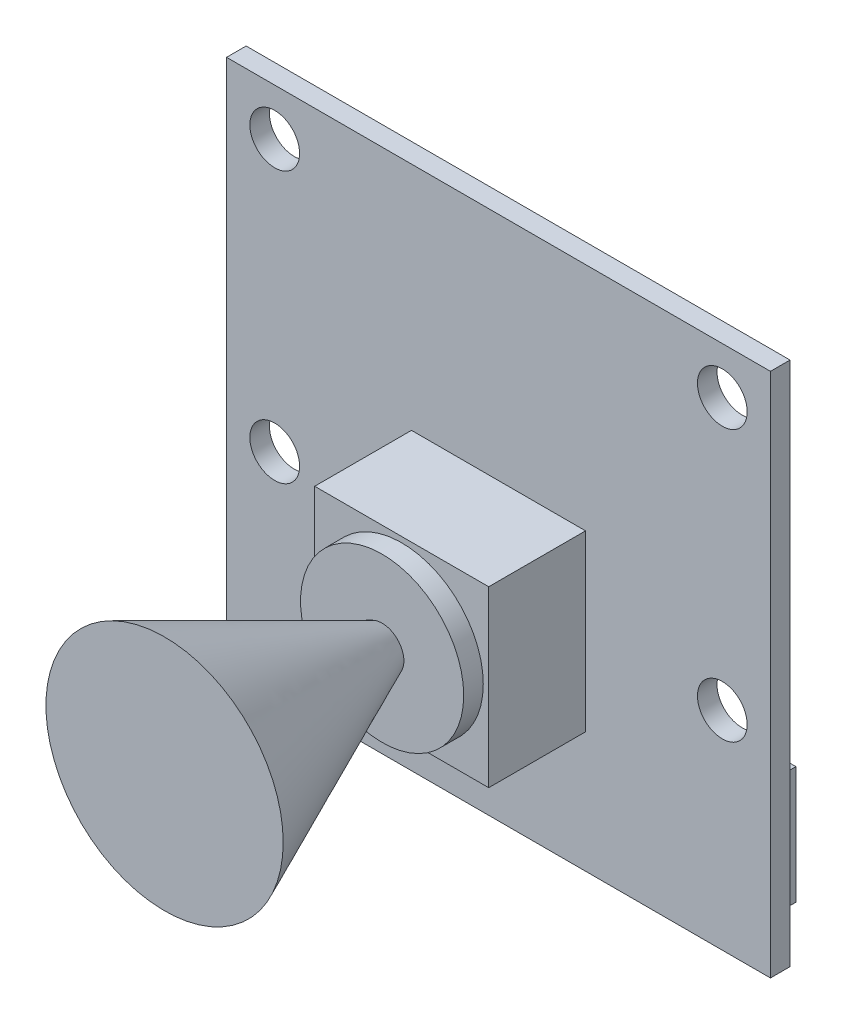
ISO-10303-21;
HEADER;
FILE_DESCRIPTION(('STEP AP214'),'2;1');
FILE_NAME('part.step','',(''),(''),'','','');
FILE_SCHEMA(('AUTOMOTIVE_DESIGN { 1 0 10303 214 1 1 1 1 }'));
ENDSEC;
DATA;
#1=APPLICATION_CONTEXT('core data for automotive mechanical design processes');
#2=APPLICATION_PROTOCOL_DEFINITION('international standard','automotive_design',2000,#1);
#3=PRODUCT_CONTEXT('',#1,'mechanical');
#4=PRODUCT('Part','Part','',(#3));
#5=PRODUCT_RELATED_PRODUCT_CATEGORY('part','',(#4));
#6=PRODUCT_DEFINITION_FORMATION('','',#4);
#7=PRODUCT_DEFINITION_CONTEXT('part definition',#1,'design');
#8=PRODUCT_DEFINITION('design','',#6,#7);
#9=PRODUCT_DEFINITION_SHAPE('','',#8);
#10=(LENGTH_UNIT() NAMED_UNIT(*) SI_UNIT(.MILLI.,.METRE.));
#11=(NAMED_UNIT(*) PLANE_ANGLE_UNIT() SI_UNIT($,.RADIAN.));
#12=(NAMED_UNIT(*) SI_UNIT($,.STERADIAN.) SOLID_ANGLE_UNIT());
#13=UNCERTAINTY_MEASURE_WITH_UNIT(LENGTH_MEASURE(1.E-05),#10,'distance_accuracy_value','');
#14=(GEOMETRIC_REPRESENTATION_CONTEXT(3) GLOBAL_UNCERTAINTY_ASSIGNED_CONTEXT((#13)) GLOBAL_UNIT_ASSIGNED_CONTEXT((#10,
#11,#12)) REPRESENTATION_CONTEXT('',''));
#15=CARTESIAN_POINT('',(0.,0.,0.));
#16=DIRECTION('',(0.,0.,1.));
#17=DIRECTION('',(1.,0.,0.));
#18=AXIS2_PLACEMENT_3D('',#15,#16,#17);
#19=CARTESIAN_POINT('',(0.,-2.52499999999999,6.25));
#20=DIRECTION('',(0.,0.,1.));
#21=DIRECTION('',(1.,0.,0.));
#22=AXIS2_PLACEMENT_3D('',#19,#20,#21);
#23=PLANE('',#22);
#24=CARTESIAN_POINT('',(0.,-2.52499999999999,6.25));
#25=DIRECTION('',(0.,0.,1.));
#26=DIRECTION('',(1.,0.,0.));
#27=AXIS2_PLACEMENT_3D('',#24,#25,#26);
#28=CIRCLE('',#27,3.75);
#29=CARTESIAN_POINT('',(3.74999999999999,-2.52499999999999,6.25));
#30=VERTEX_POINT('',#29);
#31=EDGE_CURVE('E365',#30,#30,#28,.T.);
#32=ORIENTED_EDGE('',*,*,#31,.T.);
#33=EDGE_LOOP('',(#32));
#34=FACE_BOUND('',#33,.T.);
#35=CARTESIAN_POINT('',(-1.00000000000001,-2.52499999999999,6.25));
#36=CARTESIAN_POINT('',(-0.999996306994965,-2.46893499550475,6.25));
#37=CARTESIAN_POINT('',(-0.995350622196305,-2.41282762119064,6.25));
#38=CARTESIAN_POINT('',(-0.976661927148961,-2.30216098638151,6.25));
#39=CARTESIAN_POINT('',(-0.962610716278052,-2.24760312020311,6.25));
#40=CARTESIAN_POINT('',(-0.925508351376268,-2.14170667745026,6.25));
#41=CARTESIAN_POINT('',(-0.902467465794685,-2.09036450512899,6.25));
#42=CARTESIAN_POINT('',(-0.848058068879219,-1.99218539502379,6.25));
#43=CARTESIAN_POINT('',(-0.816674564418837,-1.94535677741744,6.25));
#44=CARTESIAN_POINT('',(-0.74653534628725,-1.85757712425992,6.25));
#45=CARTESIAN_POINT('',(-0.707777979460206,-1.81662741032686,6.25));
#46=CARTESIAN_POINT('',(-0.624058099402262,-1.74181622803023,6.25));
#47=CARTESIAN_POINT('',(-0.579106389450858,-1.70794267174781,6.25));
#48=CARTESIAN_POINT('',(-0.483750278218312,-1.6479248133205,6.25));
#49=CARTESIAN_POINT('',(-0.433301535903738,-1.62185086332074,6.25));
#50=CARTESIAN_POINT('',(-0.328702129475173,-1.57866080582758,6.25));
#51=CARTESIAN_POINT('',(-0.274551664243998,-1.56154421750817,6.25));
#52=CARTESIAN_POINT('',(-0.164781358807762,-1.53694853461237,6.25));
#53=CARTESIAN_POINT('',(-0.109186171138399,-1.52935886184247,6.25));
#54=CARTESIAN_POINT('',(0.00249802410029693,-1.52344386541205,6.25));
#55=CARTESIAN_POINT('',(0.0585871084118823,-1.52512000778215,6.25));
#56=CARTESIAN_POINT('',(0.170318702083456,-1.53786206881477,6.25));
#57=CARTESIAN_POINT('',(0.225949739378718,-1.54902980285331,6.25));
#58=CARTESIAN_POINT('',(0.334479304909576,-1.58068768357958,6.25));
#59=CARTESIAN_POINT('',(0.38737850996566,-1.60117550872553,6.25));
#60=CARTESIAN_POINT('',(0.488308954947386,-1.65050382307394,6.25));
#61=CARTESIAN_POINT('',(0.536392220048153,-1.67923809637645,6.25));
#62=CARTESIAN_POINT('',(0.627201871156826,-1.74434332804429,6.25));
#63=CARTESIAN_POINT('',(0.669918618627324,-1.78072772180188,6.25));
#64=CARTESIAN_POINT('',(0.749114694049686,-1.86045127580089,6.25));
#65=CARTESIAN_POINT('',(0.785530298805205,-1.90385376633376,6.25));
#66=CARTESIAN_POINT('',(0.850502101497384,-1.99607766888967,6.25));
#67=CARTESIAN_POINT('',(0.879071983385435,-2.04488943496862,6.25));
#68=CARTESIAN_POINT('',(0.927580043556275,-2.1466955786334,6.25));
#69=CARTESIAN_POINT('',(0.947509466939668,-2.19969413449917,6.25));
#70=CARTESIAN_POINT('',(0.978057662728628,-2.30832114704335,6.25));
#71=CARTESIAN_POINT('',(0.988674287085743,-2.36395020734535,6.25));
#72=CARTESIAN_POINT('',(1.00036731884419,-2.47563359029439,6.25));
#73=CARTESIAN_POINT('',(1.00153705369049,-2.53167826375401,6.25));
#74=CARTESIAN_POINT('',(0.994620413523798,-2.64319033453264,6.25));
#75=CARTESIAN_POINT('',(0.986535643532167,-2.69865783026903,6.25));
#76=CARTESIAN_POINT('',(0.96097929269167,-2.80809122999947,6.25));
#77=CARTESIAN_POINT('',(0.943397402900872,-2.86203148674256,6.25));
#78=CARTESIAN_POINT('',(0.899331060245317,-2.96614121152984,6.25));
#79=CARTESIAN_POINT('',(0.872846045806734,-3.0163104414683,6.25));
#80=CARTESIAN_POINT('',(0.812134009896514,-3.11095847371733,6.25));
#81=CARTESIAN_POINT('',(0.777992685738152,-3.15549232277643,6.25));
#82=CARTESIAN_POINT('',(0.70280326938518,-3.2382880897712,6.25));
#83=CARTESIAN_POINT('',(0.661754966280285,-3.27654981611198,6.25));
#84=CARTESIAN_POINT('',(0.573354892961709,-3.34613980725396,6.25));
#85=CARTESIAN_POINT('',(0.5259345552187,-3.37738107330094,6.25));
#86=CARTESIAN_POINT('',(0.426500332278462,-3.43138297577567,6.25));
#87=CARTESIAN_POINT('',(0.374487693527669,-3.45414590470118,6.25));
#88=CARTESIAN_POINT('',(0.267747377340753,-3.49033683046368,6.25));
#89=CARTESIAN_POINT('',(0.213043186642256,-3.50383406845142,6.25));
#90=CARTESIAN_POINT('',(0.102135047389826,-3.52142623246307,6.25));
#91=CARTESIAN_POINT('',(0.0459305897118959,-3.5255179245493,6.25));
#92=CARTESIAN_POINT('',(-0.0664434628607701,-3.52437883063078,6.25));
#93=CARTESIAN_POINT('',(-0.122612960919627,-3.51913835787382,6.25));
#94=CARTESIAN_POINT('',(-0.23324797888165,-3.49923781438483,6.25));
#95=CARTESIAN_POINT('',(-0.287714108369473,-3.48458115483023,6.25));
#96=CARTESIAN_POINT('',(-0.393314242660882,-3.44628840411159,6.25));
#97=CARTESIAN_POINT('',(-0.444452139636769,-3.42266303069248,6.25));
#98=CARTESIAN_POINT('',(-0.542049700017669,-3.36716609083734,6.25));
#99=CARTESIAN_POINT('',(-0.588508225875332,-3.3352925259689,6.25));
#100=CARTESIAN_POINT('',(-0.675484093255291,-3.2642418146366,6.25));
#101=CARTESIAN_POINT('',(-0.715999082307131,-3.2250617901135,6.25));
#102=CARTESIAN_POINT('',(-0.789941009538081,-3.14050354115835,6.25));
#103=CARTESIAN_POINT('',(-0.823368256352866,-3.09512558675664,6.25));
#104=CARTESIAN_POINT('',(-0.882385176044294,-2.99903106093783,6.25));
#105=CARTESIAN_POINT('',(-0.907910462738526,-2.94827493494494,6.25));
#106=CARTESIAN_POINT('',(-0.949919874340684,-2.84320184102994,6.25));
#107=CARTESIAN_POINT('',(-0.966415862319407,-2.78888965082777,6.25));
#108=CARTESIAN_POINT('',(-0.985454454021836,-2.6993484569695,6.25));
#109=CARTESIAN_POINT('',(-0.990917483215469,-2.66471303557232,6.25));
#110=CARTESIAN_POINT('',(-0.998191720994227,-2.59505730152406,6.25));
#111=CARTESIAN_POINT('',(-1.00000230788421,-2.56003692436812,6.25));
#112=CARTESIAN_POINT('',(-1.00000000000001,-2.52499999999999,6.25));
#113=B_SPLINE_CURVE_WITH_KNOTS('',3,(#35,#36,#37,#38,#39,#40,#41,#42,#43,#44,#45,#46,#47,#48,
#49,#50,#51,#52,#53,#54,#55,#56,#57,#58,#59,#60,#61,#62,#63,#64,#65,#66,#67,#68,#69,#70,#71,#72,
#73,#74,#75,#76,#77,#78,#79,#80,#81,#82,#83,#84,#85,#86,#87,#88,#89,#90,#91,#92,#93,#94,#95,#96,
#97,#98,#99,#100,#101,#102,#103,#104,#105,#106,#107,#108,#109,#110,#111,#112),.UNSPECIFIED.,.T.,
.F.,(4,2,2,2,2,2,2,2,2,2,2,2,2,2,2,2,2,2,2,2,2,2,2,2,2,2,2,2,2,2,2,2,2,2,2,2,2,2,4),(0.,
0.16806481134177,0.336276348592942,0.504296306217517,0.672620290457807,0.840982056034648,
1.00905382055622,1.17859879243335,1.34813466230021,1.51568397790197,1.68325980379473,
1.85265622139595,2.02201046712321,2.18927441823616,2.3568346148147,2.52600118570525,
2.69487080683166,2.86391113658914,3.03299044618626,3.20039732340819,3.36777517142616,
3.53714027900402,3.70651607146694,3.87408309899501,4.04165524424901,4.2112016686703,
4.38070221529105,4.54892190246147,4.71719942047655,4.88565171175275,5.05404301264137,
5.22223371369207,5.39046520343676,5.55876310111044,5.72705366874785,5.8966814382409,
6.06608580542762,6.17109733791551,6.27612674328061),.UNSPECIFIED.);
#114=CARTESIAN_POINT('',(0.999999999999994,-2.52499999999999,6.25));
#115=VERTEX_POINT('',#114);
#116=EDGE_CURVE('E170',#115,#115,#113,.F.);
#117=ORIENTED_EDGE('',*,*,#116,.F.);
#118=EDGE_LOOP('',(#117));
#119=FACE_BOUND('',#118,.T.);
#120=ADVANCED_FACE('F55',(#34,#119),#23,.T.);
#121=CARTESIAN_POINT('',(0.,0.,5.35));
#122=DIRECTION('',(0.,0.,1.));
#123=DIRECTION('',(1.,0.,0.));
#124=AXIS2_PLACEMENT_3D('',#121,#122,#123);
#125=PLANE('',#124);
#126=DIRECTION('',(0.,-1.,0.));
#127=VECTOR('',#126,1.);
#128=CARTESIAN_POINT('',(-4.00000000000001,1.47500000000001,5.35));
#129=LINE('',#128,#127);
#130=CARTESIAN_POINT('',(-4.00000000000001,1.47500000000001,5.35));
#131=VERTEX_POINT('',#130);
#132=CARTESIAN_POINT('',(-4.00000000000001,-6.52499999999999,5.35));
#133=VERTEX_POINT('',#132);
#134=EDGE_CURVE('E374',#131,#133,#129,.T.);
#135=ORIENTED_EDGE('',*,*,#134,.T.);
#136=DIRECTION('',(1.,0.,0.));
#137=VECTOR('',#136,1.);
#138=CARTESIAN_POINT('',(-4.00000000000001,-6.52499999999999,5.35));
#139=LINE('',#138,#137);
#140=CARTESIAN_POINT('',(3.99999999999999,-6.52499999999999,5.35));
#141=VERTEX_POINT('',#140);
#142=EDGE_CURVE('E402',#133,#141,#139,.T.);
#143=ORIENTED_EDGE('',*,*,#142,.T.);
#144=DIRECTION('',(0.,1.,0.));
#145=VECTOR('',#144,1.);
#146=CARTESIAN_POINT('',(3.99999999999999,1.47500000000001,5.35));
#147=LINE('',#146,#145);
#148=CARTESIAN_POINT('',(3.99999999999999,1.47500000000001,5.35));
#149=VERTEX_POINT('',#148);
#150=EDGE_CURVE('E381',#141,#149,#147,.T.);
#151=ORIENTED_EDGE('',*,*,#150,.T.);
#152=DIRECTION('',(-1.,0.,0.));
#153=VECTOR('',#152,1.);
#154=CARTESIAN_POINT('',(-4.00000000000001,1.47500000000001,5.35));
#155=LINE('',#154,#153);
#156=EDGE_CURVE('E378',#149,#131,#155,.T.);
#157=ORIENTED_EDGE('',*,*,#156,.T.);
#158=EDGE_LOOP('',(#135,#143,#151,#157));
#159=FACE_BOUND('',#158,.T.);
#160=CARTESIAN_POINT('',(0.,-2.52499999999999,5.35));
#161=DIRECTION('',(0.,0.,1.));
#162=DIRECTION('',(1.,0.,0.));
#163=AXIS2_PLACEMENT_3D('',#160,#161,#162);
#164=CIRCLE('',#163,3.75);
#165=CARTESIAN_POINT('',(3.74999999999999,-2.52499999999999,5.35));
#166=VERTEX_POINT('',#165);
#167=EDGE_CURVE('E229',#166,#166,#164,.T.);
#168=ORIENTED_EDGE('',*,*,#167,.F.);
#169=EDGE_LOOP('',(#168));
#170=FACE_BOUND('',#169,.T.);
#171=ADVANCED_FACE('F237',(#159,#170),#125,.T.);
#172=CARTESIAN_POINT('',(0.,0.,0.9));
#173=DIRECTION('',(0.,0.,-1.));
#174=DIRECTION('',(-1.,0.,0.));
#175=AXIS2_PLACEMENT_3D('',#172,#173,#174);
#176=PLANE('',#175);
#177=CARTESIAN_POINT('',(-10.2869999999995,-2.52099999999997,0.9));
#178=DIRECTION('',(0.,0.,1.));
#179=DIRECTION('',(1.,0.,0.));
#180=AXIS2_PLACEMENT_3D('',#177,#178,#179);
#181=CIRCLE('',#180,1.143);
#182=CARTESIAN_POINT('',(-9.14399999999952,-2.52099999999997,0.9));
#183=VERTEX_POINT('',#182);
#184=EDGE_CURVE('E327',#183,#183,#181,.T.);
#185=ORIENTED_EDGE('',*,*,#184,.F.);
#186=EDGE_LOOP('',(#185));
#187=FACE_BOUND('',#186,.T.);
#188=CARTESIAN_POINT('',(10.2870000000005,-2.52099999999998,0.9));
#189=DIRECTION('',(0.,0.,1.));
#190=DIRECTION('',(1.,0.,0.));
#191=AXIS2_PLACEMENT_3D('',#188,#189,#190);
#192=CIRCLE('',#191,1.143);
#193=CARTESIAN_POINT('',(11.4300000000005,-2.52099999999998,0.9));
#194=VERTEX_POINT('',#193);
#195=EDGE_CURVE('E324',#194,#194,#192,.T.);
#196=ORIENTED_EDGE('',*,*,#195,.F.);
#197=EDGE_LOOP('',(#196));
#198=FACE_BOUND('',#197,.T.);
#199=CARTESIAN_POINT('',(10.287,9.92500000000002,0.9));
#200=DIRECTION('',(0.,0.,1.));
#201=DIRECTION('',(1.,0.,0.));
#202=AXIS2_PLACEMENT_3D('',#199,#200,#201);
#203=CIRCLE('',#202,1.143);
#204=CARTESIAN_POINT('',(11.43,9.92500000000002,0.9));
#205=VERTEX_POINT('',#204);
#206=EDGE_CURVE('E320',#205,#205,#203,.T.);
#207=ORIENTED_EDGE('',*,*,#206,.F.);
#208=EDGE_LOOP('',(#207));
#209=FACE_BOUND('',#208,.T.);
#210=CARTESIAN_POINT('',(-10.287,9.92500000000002,0.9));
#211=DIRECTION('',(0.,0.,1.));
#212=DIRECTION('',(1.,0.,0.));
#213=AXIS2_PLACEMENT_3D('',#210,#211,#212);
#214=CIRCLE('',#213,1.143);
#215=CARTESIAN_POINT('',(-9.144,9.92500000000002,0.9));
#216=VERTEX_POINT('',#215);
#217=EDGE_CURVE('E316',#216,#216,#214,.T.);
#218=ORIENTED_EDGE('',*,*,#217,.F.);
#219=EDGE_LOOP('',(#218));
#220=FACE_BOUND('',#219,.T.);
#221=DIRECTION('',(0.,-1.,0.));
#222=VECTOR('',#221,1.);
#223=CARTESIAN_POINT('',(-12.5,12.075,0.9));
#224=LINE('',#223,#222);
#225=CARTESIAN_POINT('',(-12.5,12.075,0.9));
#226=VERTEX_POINT('',#225);
#227=CARTESIAN_POINT('',(-12.5,-12.075,0.9));
#228=VERTEX_POINT('',#227);
#229=EDGE_CURVE('E355',#226,#228,#224,.T.);
#230=ORIENTED_EDGE('',*,*,#229,.T.);
#231=DIRECTION('',(1.,0.,0.));
#232=VECTOR('',#231,1.);
#233=CARTESIAN_POINT('',(12.5,-12.075,0.9));
#234=LINE('',#233,#232);
#235=CARTESIAN_POINT('',(12.5,-12.075,0.9));
#236=VERTEX_POINT('',#235);
#237=EDGE_CURVE('E388',#228,#236,#234,.T.);
#238=ORIENTED_EDGE('',*,*,#237,.T.);
#239=DIRECTION('',(0.,1.,0.));
#240=VECTOR('',#239,1.);
#241=CARTESIAN_POINT('',(12.5,12.075,0.9));
#242=LINE('',#241,#240);
#243=CARTESIAN_POINT('',(12.5,12.075,0.9));
#244=VERTEX_POINT('',#243);
#245=EDGE_CURVE('E390',#236,#244,#242,.T.);
#246=ORIENTED_EDGE('',*,*,#245,.T.);
#247=DIRECTION('',(-1.,0.,0.));
#248=VECTOR('',#247,1.);
#249=CARTESIAN_POINT('',(12.5,12.075,0.9));
#250=LINE('',#249,#248);
#251=EDGE_CURVE('E299',#244,#226,#250,.T.);
#252=ORIENTED_EDGE('',*,*,#251,.T.);
#253=EDGE_LOOP('',(#230,#238,#246,#252));
#254=FACE_BOUND('',#253,.T.);
#255=DIRECTION('',(0.,-1.,0.));
#256=VECTOR('',#255,1.);
#257=CARTESIAN_POINT('',(-4.00000000000001,1.47500000000001,0.9));
#258=LINE('',#257,#256);
#259=CARTESIAN_POINT('',(-4.00000000000001,1.47500000000001,0.9));
#260=VERTEX_POINT('',#259);
#261=CARTESIAN_POINT('',(-4.00000000000001,-6.52499999999999,0.9));
#262=VERTEX_POINT('',#261);
#263=EDGE_CURVE('E357',#260,#262,#258,.T.);
#264=ORIENTED_EDGE('',*,*,#263,.F.);
#265=DIRECTION('',(-1.,0.,0.));
#266=VECTOR('',#265,1.);
#267=CARTESIAN_POINT('',(-4.00000000000001,1.47500000000001,0.9));
#268=LINE('',#267,#266);
#269=CARTESIAN_POINT('',(3.99999999999999,1.47500000000001,0.9));
#270=VERTEX_POINT('',#269);
#271=EDGE_CURVE('E359',#270,#260,#268,.T.);
#272=ORIENTED_EDGE('',*,*,#271,.F.);
#273=DIRECTION('',(0.,1.,0.));
#274=VECTOR('',#273,1.);
#275=CARTESIAN_POINT('',(3.99999999999999,1.47500000000001,0.9));
#276=LINE('',#275,#274);
#277=CARTESIAN_POINT('',(3.99999999999999,-6.52499999999999,0.9));
#278=VERTEX_POINT('',#277);
#279=EDGE_CURVE('E375',#278,#270,#276,.T.);
#280=ORIENTED_EDGE('',*,*,#279,.F.);
#281=DIRECTION('',(1.,0.,0.));
#282=VECTOR('',#281,1.);
#283=CARTESIAN_POINT('',(-4.00000000000001,-6.52499999999999,0.9));
#284=LINE('',#283,#282);
#285=EDGE_CURVE('E362',#262,#278,#284,.T.);
#286=ORIENTED_EDGE('',*,*,#285,.F.);
#287=EDGE_LOOP('',(#264,#272,#280,#286));
#288=FACE_BOUND('',#287,.T.);
#289=ADVANCED_FACE('F246',(#187,#198,#209,#220,#254,#288),#176,.F.);
#290=CARTESIAN_POINT('',(-12.5,12.075,0.9));
#291=DIRECTION('',(1.,0.,0.));
#292=DIRECTION('',(0.,1.,0.));
#293=AXIS2_PLACEMENT_3D('',#290,#291,#292);
#294=PLANE('',#293);
#295=DIRECTION('',(0.,-1.,0.));
#296=VECTOR('',#295,1.);
#297=CARTESIAN_POINT('',(-12.5,12.075,0.));
#298=LINE('',#297,#296);
#299=CARTESIAN_POINT('',(-12.5,12.075,0.));
#300=VERTEX_POINT('',#299);
#301=CARTESIAN_POINT('',(-12.5,-12.075,0.));
#302=VERTEX_POINT('',#301);
#303=EDGE_CURVE('E288',#300,#302,#298,.T.);
#304=ORIENTED_EDGE('',*,*,#303,.T.);
#305=DIRECTION('',(0.,0.,-1.));
#306=VECTOR('',#305,1.);
#307=CARTESIAN_POINT('',(-12.5,-12.075,0.9));
#308=LINE('',#307,#306);
#309=EDGE_CURVE('E13',#228,#302,#308,.T.);
#310=ORIENTED_EDGE('',*,*,#309,.F.);
#311=ORIENTED_EDGE('',*,*,#229,.F.);
#312=DIRECTION('',(0.,0.,-1.));
#313=VECTOR('',#312,1.);
#314=CARTESIAN_POINT('',(-12.5,12.075,0.9));
#315=LINE('',#314,#313);
#316=EDGE_CURVE('E291',#226,#300,#315,.T.);
#317=ORIENTED_EDGE('',*,*,#316,.T.);
#318=EDGE_LOOP('',(#304,#310,#311,#317));
#319=FACE_BOUND('',#318,.T.);
#320=ADVANCED_FACE('F57',(#319),#294,.F.);
#321=CARTESIAN_POINT('',(12.5,-12.075,0.9));
#322=DIRECTION('',(0.,1.,0.));
#323=DIRECTION('',(-1.,0.,0.));
#324=AXIS2_PLACEMENT_3D('',#321,#322,#323);
#325=PLANE('',#324);
#326=DIRECTION('',(1.,0.,0.));
#327=VECTOR('',#326,1.);
#328=CARTESIAN_POINT('',(12.5,-12.075,0.));
#329=LINE('',#328,#327);
#330=CARTESIAN_POINT('',(-10.08,-12.075,0.));
#331=VERTEX_POINT('',#330);
#332=EDGE_CURVE('E231',#302,#331,#329,.T.);
#333=ORIENTED_EDGE('',*,*,#332,.T.);
#334=DIRECTION('',(0.,0.,1.));
#335=VECTOR('',#334,1.);
#336=CARTESIAN_POINT('',(-10.08,-12.075,-2.7));
#337=LINE('',#336,#335);
#338=CARTESIAN_POINT('',(-10.08,-12.075,-2.7));
#339=VERTEX_POINT('',#338);
#340=EDGE_CURVE('E151',#339,#331,#337,.T.);
#341=ORIENTED_EDGE('',*,*,#340,.F.);
#342=DIRECTION('',(-1.,0.,0.));
#343=VECTOR('',#342,1.);
#344=CARTESIAN_POINT('',(10.07,-12.075,-2.7));
#345=LINE('',#344,#343);
#346=CARTESIAN_POINT('',(10.07,-12.075,-2.7));
#347=VERTEX_POINT('',#346);
#348=EDGE_CURVE('E144',#347,#339,#345,.T.);
#349=ORIENTED_EDGE('',*,*,#348,.F.);
#350=DIRECTION('',(0.,0.,1.));
#351=VECTOR('',#350,1.);
#352=CARTESIAN_POINT('',(10.07,-12.075,-2.7));
#353=LINE('',#352,#351);
#354=CARTESIAN_POINT('',(10.07,-12.075,0.));
#355=VERTEX_POINT('',#354);
#356=EDGE_CURVE('E149',#347,#355,#353,.T.);
#357=ORIENTED_EDGE('',*,*,#356,.T.);
#358=CARTESIAN_POINT('',(12.5,-12.075,0.));
#359=VERTEX_POINT('',#358);
#360=EDGE_CURVE('E77',#355,#359,#329,.T.);
#361=ORIENTED_EDGE('',*,*,#360,.T.);
#362=DIRECTION('',(0.,0.,-1.));
#363=VECTOR('',#362,1.);
#364=CARTESIAN_POINT('',(12.5,-12.075,0.9));
#365=LINE('',#364,#363);
#366=EDGE_CURVE('E64',#236,#359,#365,.T.);
#367=ORIENTED_EDGE('',*,*,#366,.F.);
#368=ORIENTED_EDGE('',*,*,#237,.F.);
#369=ORIENTED_EDGE('',*,*,#309,.T.);
#370=EDGE_LOOP('',(#333,#341,#349,#357,#361,#367,#368,#369));
#371=FACE_BOUND('',#370,.T.);
#372=ADVANCED_FACE('F147',(#371),#325,.F.);
#373=CARTESIAN_POINT('',(12.5,12.075,0.9));
#374=DIRECTION('',(-1.,0.,0.));
#375=DIRECTION('',(0.,-1.,0.));
#376=AXIS2_PLACEMENT_3D('',#373,#374,#375);
#377=PLANE('',#376);
#378=DIRECTION('',(0.,1.,0.));
#379=VECTOR('',#378,1.);
#380=CARTESIAN_POINT('',(12.5,12.075,0.));
#381=LINE('',#380,#379);
#382=CARTESIAN_POINT('',(12.5,12.075,0.));
#383=VERTEX_POINT('',#382);
#384=EDGE_CURVE('E303',#359,#383,#381,.T.);
#385=ORIENTED_EDGE('',*,*,#384,.T.);
#386=DIRECTION('',(0.,0.,-1.));
#387=VECTOR('',#386,1.);
#388=CARTESIAN_POINT('',(12.5,12.075,0.9));
#389=LINE('',#388,#387);
#390=EDGE_CURVE('E394',#244,#383,#389,.T.);
#391=ORIENTED_EDGE('',*,*,#390,.F.);
#392=ORIENTED_EDGE('',*,*,#245,.F.);
#393=ORIENTED_EDGE('',*,*,#366,.T.);
#394=EDGE_LOOP('',(#385,#391,#392,#393));
#395=FACE_BOUND('',#394,.T.);
#396=ADVANCED_FACE('F273',(#395),#377,.F.);
#397=CARTESIAN_POINT('',(12.5,12.075,0.9));
#398=DIRECTION('',(0.,-1.,0.));
#399=DIRECTION('',(1.,0.,0.));
#400=AXIS2_PLACEMENT_3D('',#397,#398,#399);
#401=PLANE('',#400);
#402=DIRECTION('',(-1.,0.,0.));
#403=VECTOR('',#402,1.);
#404=CARTESIAN_POINT('',(12.5,12.075,0.));
#405=LINE('',#404,#403);
#406=EDGE_CURVE('E389',#383,#300,#405,.T.);
#407=ORIENTED_EDGE('',*,*,#406,.T.);
#408=ORIENTED_EDGE('',*,*,#316,.F.);
#409=ORIENTED_EDGE('',*,*,#251,.F.);
#410=ORIENTED_EDGE('',*,*,#390,.T.);
#411=EDGE_LOOP('',(#407,#408,#409,#410));
#412=FACE_BOUND('',#411,.T.);
#413=ADVANCED_FACE('F269',(#412),#401,.F.);
#414=CARTESIAN_POINT('',(0.,0.,0.));
#415=DIRECTION('',(0.,0.,-1.));
#416=DIRECTION('',(-1.,0.,0.));
#417=AXIS2_PLACEMENT_3D('',#414,#415,#416);
#418=PLANE('',#417);
#419=CARTESIAN_POINT('',(-10.2869999999995,-2.52099999999997,0.));
#420=DIRECTION('',(0.,0.,-1.));
#421=DIRECTION('',(-1.,0.,0.));
#422=AXIS2_PLACEMENT_3D('',#419,#420,#421);
#423=CIRCLE('',#422,1.143);
#424=CARTESIAN_POINT('',(-11.4299999999995,-2.52099999999997,0.));
#425=VERTEX_POINT('',#424);
#426=EDGE_CURVE('E59',#425,#425,#423,.T.);
#427=ORIENTED_EDGE('',*,*,#426,.F.);
#428=EDGE_LOOP('',(#427));
#429=FACE_BOUND('',#428,.T.);
#430=CARTESIAN_POINT('',(10.2870000000005,-2.52099999999998,0.));
#431=DIRECTION('',(0.,0.,-1.));
#432=DIRECTION('',(-1.,0.,0.));
#433=AXIS2_PLACEMENT_3D('',#430,#431,#432);
#434=CIRCLE('',#433,1.143);
#435=CARTESIAN_POINT('',(9.14400000000049,-2.52099999999998,0.));
#436=VERTEX_POINT('',#435);
#437=EDGE_CURVE('E323',#436,#436,#434,.T.);
#438=ORIENTED_EDGE('',*,*,#437,.F.);
#439=EDGE_LOOP('',(#438));
#440=FACE_BOUND('',#439,.T.);
#441=CARTESIAN_POINT('',(10.287,9.92500000000002,0.));
#442=DIRECTION('',(0.,0.,-1.));
#443=DIRECTION('',(-1.,0.,0.));
#444=AXIS2_PLACEMENT_3D('',#441,#442,#443);
#445=CIRCLE('',#444,1.143);
#446=CARTESIAN_POINT('',(9.144,9.92500000000002,0.));
#447=VERTEX_POINT('',#446);
#448=EDGE_CURVE('E319',#447,#447,#445,.T.);
#449=ORIENTED_EDGE('',*,*,#448,.F.);
#450=EDGE_LOOP('',(#449));
#451=FACE_BOUND('',#450,.T.);
#452=CARTESIAN_POINT('',(-10.287,9.92500000000002,0.));
#453=DIRECTION('',(0.,0.,-1.));
#454=DIRECTION('',(-1.,0.,0.));
#455=AXIS2_PLACEMENT_3D('',#452,#453,#454);
#456=CIRCLE('',#455,1.143);
#457=CARTESIAN_POINT('',(-11.43,9.92500000000002,0.));
#458=VERTEX_POINT('',#457);
#459=EDGE_CURVE('E182',#458,#458,#456,.T.);
#460=ORIENTED_EDGE('',*,*,#459,.F.);
#461=EDGE_LOOP('',(#460));
#462=FACE_BOUND('',#461,.T.);
#463=DIRECTION('',(0.,-1.,0.));
#464=VECTOR('',#463,1.);
#465=CARTESIAN_POINT('',(10.07,-6.67499999999999,0.));
#466=LINE('',#465,#464);
#467=CARTESIAN_POINT('',(10.07,-6.67499999999999,0.));
#468=VERTEX_POINT('',#467);
#469=EDGE_CURVE('E72',#468,#355,#466,.T.);
#470=ORIENTED_EDGE('',*,*,#469,.F.);
#471=DIRECTION('',(1.,0.,0.));
#472=VECTOR('',#471,1.);
#473=CARTESIAN_POINT('',(10.07,-6.67499999999999,0.));
#474=LINE('',#473,#472);
#475=CARTESIAN_POINT('',(-10.08,-6.67499999999999,0.));
#476=VERTEX_POINT('',#475);
#477=EDGE_CURVE('E164',#476,#468,#474,.T.);
#478=ORIENTED_EDGE('',*,*,#477,.F.);
#479=DIRECTION('',(0.,1.,0.));
#480=VECTOR('',#479,1.);
#481=CARTESIAN_POINT('',(-10.08,-6.67499999999999,0.));
#482=LINE('',#481,#480);
#483=EDGE_CURVE('E181',#331,#476,#482,.T.);
#484=ORIENTED_EDGE('',*,*,#483,.F.);
#485=ORIENTED_EDGE('',*,*,#332,.F.);
#486=ORIENTED_EDGE('',*,*,#303,.F.);
#487=ORIENTED_EDGE('',*,*,#406,.F.);
#488=ORIENTED_EDGE('',*,*,#384,.F.);
#489=ORIENTED_EDGE('',*,*,#360,.F.);
#490=EDGE_LOOP('',(#470,#478,#484,#485,#486,#487,#488,#489));
#491=FACE_BOUND('',#490,.T.);
#492=ADVANCED_FACE('F262',(#429,#440,#451,#462,#491),#418,.T.);
#493=CARTESIAN_POINT('',(-4.00000000000001,1.47500000000001,5.35));
#494=DIRECTION('',(1.,0.,0.));
#495=DIRECTION('',(0.,1.,0.));
#496=AXIS2_PLACEMENT_3D('',#493,#494,#495);
#497=PLANE('',#496);
#498=ORIENTED_EDGE('',*,*,#263,.T.);
#499=DIRECTION('',(0.,0.,-1.));
#500=VECTOR('',#499,1.);
#501=CARTESIAN_POINT('',(-4.00000000000001,-6.52499999999999,5.35));
#502=LINE('',#501,#500);
#503=EDGE_CURVE('E293',#133,#262,#502,.T.);
#504=ORIENTED_EDGE('',*,*,#503,.F.);
#505=ORIENTED_EDGE('',*,*,#134,.F.);
#506=DIRECTION('',(0.,0.,-1.));
#507=VECTOR('',#506,1.);
#508=CARTESIAN_POINT('',(-4.00000000000001,1.47500000000001,5.35));
#509=LINE('',#508,#507);
#510=EDGE_CURVE('E370',#131,#260,#509,.T.);
#511=ORIENTED_EDGE('',*,*,#510,.T.);
#512=EDGE_LOOP('',(#498,#504,#505,#511));
#513=FACE_BOUND('',#512,.T.);
#514=ADVANCED_FACE('F258',(#513),#497,.F.);
#515=CARTESIAN_POINT('',(-4.00000000000001,-6.52499999999999,5.35));
#516=DIRECTION('',(0.,1.,0.));
#517=DIRECTION('',(-1.,0.,0.));
#518=AXIS2_PLACEMENT_3D('',#515,#516,#517);
#519=PLANE('',#518);
#520=ORIENTED_EDGE('',*,*,#285,.T.);
#521=DIRECTION('',(0.,0.,-1.));
#522=VECTOR('',#521,1.);
#523=CARTESIAN_POINT('',(3.99999999999999,-6.52499999999999,5.35));
#524=LINE('',#523,#522);
#525=EDGE_CURVE('E296',#141,#278,#524,.T.);
#526=ORIENTED_EDGE('',*,*,#525,.F.);
#527=ORIENTED_EDGE('',*,*,#142,.F.);
#528=ORIENTED_EDGE('',*,*,#503,.T.);
#529=EDGE_LOOP('',(#520,#526,#527,#528));
#530=FACE_BOUND('',#529,.T.);
#531=ADVANCED_FACE('F254',(#530),#519,.F.);
#532=CARTESIAN_POINT('',(3.99999999999999,1.47500000000001,5.35));
#533=DIRECTION('',(-1.,0.,0.));
#534=DIRECTION('',(0.,0.,1.));
#535=AXIS2_PLACEMENT_3D('',#532,#533,#534);
#536=PLANE('',#535);
#537=ORIENTED_EDGE('',*,*,#279,.T.);
#538=DIRECTION('',(0.,0.,-1.));
#539=VECTOR('',#538,1.);
#540=CARTESIAN_POINT('',(3.99999999999999,1.47500000000001,5.35));
#541=LINE('',#540,#539);
#542=EDGE_CURVE('E373',#149,#270,#541,.T.);
#543=ORIENTED_EDGE('',*,*,#542,.F.);
#544=ORIENTED_EDGE('',*,*,#150,.F.);
#545=ORIENTED_EDGE('',*,*,#525,.T.);
#546=EDGE_LOOP('',(#537,#543,#544,#545));
#547=FACE_BOUND('',#546,.T.);
#548=ADVANCED_FACE('F250',(#547),#536,.F.);
#549=CARTESIAN_POINT('',(-4.00000000000001,1.47500000000001,5.35));
#550=DIRECTION('',(0.,-1.,0.));
#551=DIRECTION('',(0.,0.,-1.));
#552=AXIS2_PLACEMENT_3D('',#549,#550,#551);
#553=PLANE('',#552);
#554=ORIENTED_EDGE('',*,*,#271,.T.);
#555=ORIENTED_EDGE('',*,*,#510,.F.);
#556=ORIENTED_EDGE('',*,*,#156,.F.);
#557=ORIENTED_EDGE('',*,*,#542,.T.);
#558=EDGE_LOOP('',(#554,#555,#556,#557));
#559=FACE_BOUND('',#558,.T.);
#560=ADVANCED_FACE('F242',(#559),#553,.F.);
#561=CARTESIAN_POINT('',(0.,-2.52499999999999,6.25));
#562=DIRECTION('',(0.,0.,-1.));
#563=DIRECTION('',(-1.,0.,0.));
#564=AXIS2_PLACEMENT_3D('',#561,#562,#563);
#565=CYLINDRICAL_SURFACE('',#564,3.75);
#566=ORIENTED_EDGE('',*,*,#31,.F.);
#567=EDGE_LOOP('',(#566));
#568=FACE_BOUND('',#567,.T.);
#569=ORIENTED_EDGE('',*,*,#167,.T.);
#570=EDGE_LOOP('',(#569));
#571=FACE_BOUND('',#570,.T.);
#572=ADVANCED_FACE('F239',(#568,#571),#565,.T.);
#573=CARTESIAN_POINT('',(0.,-2.52499999999999,16.25));
#574=DIRECTION('',(0.,0.,1.));
#575=DIRECTION('',(1.,0.,0.));
#576=AXIS2_PLACEMENT_3D('',#573,#574,#575);
#577=PLANE('',#576);
#578=CARTESIAN_POINT('',(0.,-2.52499999999999,16.25));
#579=DIRECTION('',(0.,0.,1.));
#580=DIRECTION('',(1.,0.,0.));
#581=AXIS2_PLACEMENT_3D('',#578,#579,#580);
#582=CIRCLE('',#581,5.45332960127772);
#583=CARTESIAN_POINT('',(5.45332960127771,-2.52499999999999,16.25));
#584=VERTEX_POINT('',#583);
#585=EDGE_CURVE('E167',#584,#584,#582,.T.);
#586=ORIENTED_EDGE('',*,*,#585,.T.);
#587=EDGE_LOOP('',(#586));
#588=FACE_BOUND('',#587,.T.);
#589=ADVANCED_FACE('F213',(#588),#577,.T.);
#590=CARTESIAN_POINT('',(0.999999999999994,-2.52499999999999,6.25));
#591=CARTESIAN_POINT('',(2.4844432004259,-2.52499999999999,9.58333333333333));
#592=CARTESIAN_POINT('',(3.96888640085181,-2.52499999999999,12.9166666666667));
#593=CARTESIAN_POINT('',(5.45332960127771,-2.52499999999999,16.25));
#594=CARTESIAN_POINT('',(0.999999999999994,-2.49740424950383,6.25));
#595=CARTESIAN_POINT('',(2.4844432004259,-2.45643992531916,9.58333333333333));
#596=CARTESIAN_POINT('',(3.96888640085181,-2.4154756011345,12.9166666666667));
#597=CARTESIAN_POINT('',(5.45332960127771,-2.37451127694983,16.25));
#598=CARTESIAN_POINT('',(0.997759575049609,-2.44273189861075,6.25));
#599=CARTESIAN_POINT('',(2.47887699189185,-2.32060957489156,9.58333333333333));
#600=CARTESIAN_POINT('',(3.9599944087341,-2.19848725117236,12.9166666666667));
#601=CARTESIAN_POINT('',(5.44111182557634,-2.07636492745316,16.25));
#602=CARTESIAN_POINT('',(0.987935854000552,-2.3625390137965,6.25));
#603=CARTESIAN_POINT('',(2.45447051492864,-2.12137490749225,9.58333333333333));
#604=CARTESIAN_POINT('',(3.92100517585673,-1.880210801188,12.9166666666667));
#605=CARTESIAN_POINT('',(5.38753983678482,-1.63904669488374,16.25));
#606=CARTESIAN_POINT('',(0.971907240555687,-2.28441996173529,6.25));
#607=CARTESIAN_POINT('',(2.41464833524329,-1.92729255977505,9.58333333333333));
#608=CARTESIAN_POINT('',(3.8573894299309,-1.57016515781481,12.9166666666667));
#609=CARTESIAN_POINT('',(5.3001305246185,-1.21303775585457,16.25));
#610=CARTESIAN_POINT('',(0.840055352877692,-1.82969779325228,6.25));
#611=CARTESIAN_POINT('',(2.08706980943838,-0.797561160204515,9.58333333333333));
#612=CARTESIAN_POINT('',(3.33408426599906,0.234575472843249,12.9166666666667));
#613=CARTESIAN_POINT('',(4.58109872255975,1.26671210589101,16.25));
#614=CARTESIAN_POINT('',(0.441532007938474,-1.52499999999999,6.25));
#615=CARTESIAN_POINT('',(1.09696119489315,-0.0405567995740794,9.58333333333333));
#616=CARTESIAN_POINT('',(1.75239038184782,1.44388640085183,12.9166666666667));
#617=CARTESIAN_POINT('',(2.4078195688025,2.92832960127773,16.25));
#618=CARTESIAN_POINT('',(-0.551915009923106,-1.52499999999999,6.25));
#619=CARTESIAN_POINT('',(-1.37120149361645,-0.0405567995740794,9.58333333333333));
#620=CARTESIAN_POINT('',(-2.19048797730979,1.44388640085183,12.9166666666667));
#621=CARTESIAN_POINT('',(-3.00977446100313,2.92832960127773,16.25));
#622=CARTESIAN_POINT('',(-1.00000000000001,-1.97308499007689,6.25));
#623=CARTESIAN_POINT('',(-2.48444320042591,-1.15379850638354,9.58333333333333));
#624=CARTESIAN_POINT('',(-3.96888640085182,-0.3345120226902,12.9166666666667));
#625=CARTESIAN_POINT('',(-5.45332960127773,0.484774461003143,16.25));
#626=CARTESIAN_POINT('',(-1.00000000000001,-3.07691500992309,6.25));
#627=CARTESIAN_POINT('',(-2.48444320042591,-3.89620149361643,9.58333333333333));
#628=CARTESIAN_POINT('',(-3.96888640085182,-4.71548797730977,12.9166666666667));
#629=CARTESIAN_POINT('',(-5.45332960127773,-5.53477446100312,16.25));
#630=CARTESIAN_POINT('',(-0.551915009923107,-3.52499999999999,6.25));
#631=CARTESIAN_POINT('',(-1.37120149361645,-5.00944320042589,9.58333333333333));
#632=CARTESIAN_POINT('',(-2.19048797730979,-6.4938864008518,12.9166666666667));
#633=CARTESIAN_POINT('',(-3.00977446100314,-7.97832960127771,16.25));
#634=CARTESIAN_POINT('',(0.441532007938473,-3.52499999999999,6.25));
#635=CARTESIAN_POINT('',(1.09696119489315,-5.00944320042589,9.58333333333333));
#636=CARTESIAN_POINT('',(1.75239038184782,-6.4938864008518,12.9166666666667));
#637=CARTESIAN_POINT('',(2.40781956880249,-7.97832960127771,16.25));
#638=CARTESIAN_POINT('',(0.840055352877692,-3.22030220674769,6.25));
#639=CARTESIAN_POINT('',(2.08706980943838,-4.25243883979546,9.58333333333333));
#640=CARTESIAN_POINT('',(3.33408426599906,-5.28457547284322,12.9166666666667));
#641=CARTESIAN_POINT('',(4.58109872255975,-6.31671210589099,16.25));
#642=CARTESIAN_POINT('',(0.971907240555687,-2.76558003826469,6.25));
#643=CARTESIAN_POINT('',(2.41464833524329,-3.12270744022493,9.58333333333333));
#644=CARTESIAN_POINT('',(3.8573894299309,-3.47983484218516,12.9166666666667));
#645=CARTESIAN_POINT('',(5.3001305246185,-3.8369622441454,16.25));
#646=CARTESIAN_POINT('',(0.987935854000552,-2.68746098620347,6.25));
#647=CARTESIAN_POINT('',(2.45447051492864,-2.92862509250773,9.58333333333333));
#648=CARTESIAN_POINT('',(3.92100517585673,-3.16978919881198,12.9166666666667));
#649=CARTESIAN_POINT('',(5.38753983678482,-3.41095330511623,16.25));
#650=CARTESIAN_POINT('',(0.997759575049609,-2.60726810138922,6.25));
#651=CARTESIAN_POINT('',(2.47887699189185,-2.72939042510842,9.58333333333333));
#652=CARTESIAN_POINT('',(3.9599944087341,-2.85151274882762,12.9166666666667));
#653=CARTESIAN_POINT('',(5.44111182557634,-2.97363507254681,16.25));
#654=CARTESIAN_POINT('',(0.999999999999994,-2.55259575049614,6.25));
#655=CARTESIAN_POINT('',(2.4844432004259,-2.59356007468081,9.58333333333333));
#656=CARTESIAN_POINT('',(3.96888640085181,-2.63452439886548,12.9166666666667));
#657=CARTESIAN_POINT('',(5.45332960127771,-2.67548872305014,16.25));
#658=CARTESIAN_POINT('',(0.999999999999994,-2.52499999999999,6.25));
#659=CARTESIAN_POINT('',(2.4844432004259,-2.52499999999999,9.58333333333333));
#660=CARTESIAN_POINT('',(3.96888640085181,-2.52499999999999,12.9166666666667));
#661=CARTESIAN_POINT('',(5.45332960127771,-2.52499999999999,16.25));
#662=B_SPLINE_SURFACE_WITH_KNOTS('',3,3,((#590,#591,#592,#593),(#594,#595,#596,#597),(#598,#599,
#600,#601),(#602,#603,#604,#605),(#606,#607,#608,#609),(#610,#611,#612,#613),(#614,#615,#616,
#617),(#618,#619,#620,#621),(#622,#623,#624,#625),(#626,#627,#628,#629),(#630,#631,#632,#633),
(#634,#635,#636,#637),(#638,#639,#640,#641),(#642,#643,#644,#645),(#646,#647,#648,#649),(#650,
#651,#652,#653),(#654,#655,#656,#657),(#658,#659,#660,#661)),.UNSPECIFIED.,.T.,.F.,.F.,(4,1,1,1,
1,2,2,2,1,1,1,1,4),(4,4),(0.,0.0125,0.0249999999999999,0.0375000000000001,0.05,0.25,0.5,0.75,
0.95,0.9625,0.975,0.9875,1.),(0.,1.),.UNSPECIFIED.);
#663=CARTESIAN_POINT('',(0.999999999999994,-2.52499999999999,6.25));
#664=CARTESIAN_POINT('',(1.0463888500133,-2.52499999999999,6.35416666666667));
#665=CARTESIAN_POINT('',(1.09277770002661,-2.52499999999999,6.45833333333333));
#666=CARTESIAN_POINT('',(1.18555540005323,-2.52499999999999,6.66666666666667));
#667=CARTESIAN_POINT('',(1.23194425006654,-2.52499999999999,6.77083333333333));
#668=CARTESIAN_POINT('',(1.32472195009316,-2.52499999999999,6.97916666666667));
#669=CARTESIAN_POINT('',(1.37111080010647,-2.52499999999999,7.08333333333333));
#670=CARTESIAN_POINT('',(1.46388850013309,-2.52499999999999,7.29166666666667));
#671=CARTESIAN_POINT('',(1.5102773501464,-2.52499999999999,7.39583333333333));
#672=CARTESIAN_POINT('',(1.60305505017302,-2.52499999999999,7.60416666666667));
#673=CARTESIAN_POINT('',(1.64944390018633,-2.52499999999999,7.70833333333333));
#674=CARTESIAN_POINT('',(1.74222160021295,-2.52499999999999,7.91666666666667));
#675=CARTESIAN_POINT('',(1.78861045022626,-2.52499999999999,8.02083333333333));
#676=CARTESIAN_POINT('',(1.88138815025288,-2.52499999999999,8.22916666666667));
#677=CARTESIAN_POINT('',(1.92777700026618,-2.52499999999999,8.33333333333333));
#678=CARTESIAN_POINT('',(2.0205547002928,-2.52499999999999,8.54166666666667));
#679=CARTESIAN_POINT('',(2.06694355030611,-2.52499999999999,8.64583333333333));
#680=CARTESIAN_POINT('',(2.15972125033273,-2.52499999999999,8.85416666666667));
#681=CARTESIAN_POINT('',(2.20611010034604,-2.52499999999999,8.95833333333333));
#682=CARTESIAN_POINT('',(2.29888780037266,-2.52499999999999,9.16666666666667));
#683=CARTESIAN_POINT('',(2.34527665038597,-2.52499999999999,9.27083333333333));
#684=CARTESIAN_POINT('',(2.43805435041259,-2.52499999999999,9.47916666666667));
#685=CARTESIAN_POINT('',(2.4844432004259,-2.52499999999999,9.58333333333333));
#686=CARTESIAN_POINT('',(2.57722090045252,-2.52499999999999,9.79166666666667));
#687=CARTESIAN_POINT('',(2.62360975046583,-2.52499999999999,9.89583333333333));
#688=CARTESIAN_POINT('',(2.71638745049245,-2.52499999999999,10.1041666666667));
#689=CARTESIAN_POINT('',(2.76277630050576,-2.52499999999999,10.2083333333333));
#690=CARTESIAN_POINT('',(2.85555400053238,-2.52499999999999,10.4166666666667));
#691=CARTESIAN_POINT('',(2.90194285054569,-2.52499999999999,10.5208333333333));
#692=CARTESIAN_POINT('',(2.99472055057231,-2.52499999999999,10.7291666666667));
#693=CARTESIAN_POINT('',(3.04110940058561,-2.52499999999999,10.8333333333333));
#694=CARTESIAN_POINT('',(3.13388710061223,-2.52499999999999,11.0416666666667));
#695=CARTESIAN_POINT('',(3.18027595062554,-2.52499999999999,11.1458333333333));
#696=CARTESIAN_POINT('',(3.27305365065216,-2.52499999999999,11.3541666666667));
#697=CARTESIAN_POINT('',(3.31944250066547,-2.52499999999999,11.4583333333333));
#698=CARTESIAN_POINT('',(3.41222020069209,-2.52499999999999,11.6666666666667));
#699=CARTESIAN_POINT('',(3.4586090507054,-2.52499999999999,11.7708333333333));
#700=CARTESIAN_POINT('',(3.55138675073202,-2.52499999999999,11.9791666666667));
#701=CARTESIAN_POINT('',(3.59777560074533,-2.52499999999999,12.0833333333333));
#702=CARTESIAN_POINT('',(3.69055330077195,-2.52499999999999,12.2916666666667));
#703=CARTESIAN_POINT('',(3.73694215078526,-2.52499999999999,12.3958333333333));
#704=CARTESIAN_POINT('',(3.82971985081188,-2.52499999999999,12.6041666666667));
#705=CARTESIAN_POINT('',(3.87610870082519,-2.52499999999999,12.7083333333333));
#706=CARTESIAN_POINT('',(3.96888640085181,-2.52499999999999,12.9166666666667));
#707=CARTESIAN_POINT('',(4.01527525086512,-2.52499999999999,13.0208333333333));
#708=CARTESIAN_POINT('',(4.10805295089174,-2.52499999999999,13.2291666666667));
#709=CARTESIAN_POINT('',(4.15444180090505,-2.52499999999999,13.3333333333333));
#710=CARTESIAN_POINT('',(4.24721950093167,-2.52499999999999,13.5416666666667));
#711=CARTESIAN_POINT('',(4.29360835094497,-2.52499999999999,13.6458333333333));
#712=CARTESIAN_POINT('',(4.38638605097159,-2.52499999999999,13.8541666666667));
#713=CARTESIAN_POINT('',(4.4327749009849,-2.52499999999999,13.9583333333333));
#714=CARTESIAN_POINT('',(4.52555260101152,-2.52499999999999,14.1666666666667));
#715=CARTESIAN_POINT('',(4.57194145102483,-2.52499999999999,14.2708333333333));
#716=CARTESIAN_POINT('',(4.66471915105145,-2.52499999999999,14.4791666666667));
#717=CARTESIAN_POINT('',(4.71110800106476,-2.52499999999999,14.5833333333333));
#718=CARTESIAN_POINT('',(4.80388570109138,-2.52499999999999,14.7916666666667));
#719=CARTESIAN_POINT('',(4.85027455110469,-2.52499999999999,14.8958333333333));
#720=CARTESIAN_POINT('',(4.94305225113131,-2.52499999999999,15.1041666666667));
#721=CARTESIAN_POINT('',(4.98944110114462,-2.52499999999999,15.2083333333333));
#722=CARTESIAN_POINT('',(5.08221880117124,-2.52499999999999,15.4166666666667));
#723=CARTESIAN_POINT('',(5.12860765118455,-2.52499999999999,15.5208333333333));
#724=CARTESIAN_POINT('',(5.22138535121117,-2.52499999999999,15.7291666666667));
#725=CARTESIAN_POINT('',(5.26777420122448,-2.52499999999999,15.8333333333333));
#726=CARTESIAN_POINT('',(5.36055190125109,-2.52499999999999,16.0416666666667));
#727=CARTESIAN_POINT('',(5.4069407512644,-2.52499999999999,16.1458333333333));
#728=CARTESIAN_POINT('',(5.45332960127771,-2.52499999999999,16.25));
#729=B_SPLINE_CURVE_WITH_KNOTS('',3,(#663,#664,#665,#666,#667,#668,#669,#670,#671,#672,#673,
#674,#675,#676,#677,#678,#679,#680,#681,#682,#683,#684,#685,#686,#687,#688,#689,#690,#691,#692,
#693,#694,#695,#696,#697,#698,#699,#700,#701,#702,#703,#704,#705,#706,#707,#708,#709,#710,#711,
#712,#713,#714,#715,#716,#717,#718,#719,#720,#721,#722,#723,#724,#725,#726,#727,#728),
.UNSPECIFIED.,.F.,.F.,(4,2,2,2,2,2,2,2,2,2,2,2,2,2,2,2,2,2,2,2,2,2,2,2,2,2,2,2,2,2,2,2,4),(0.,
0.34208709220024,0.684174184400481,1.02626127660072,1.36834836880096,1.7104354610012,
2.05252255320144,2.39460964540168,2.73669673760193,3.07878382980217,3.42087092200241,
3.76295801420265,4.10504510640289,4.44713219860313,4.78921929080337,5.13130638300361,
5.47339347520385,5.81548056740409,6.15756765960433,6.49965475180457,6.84174184400481,
7.18382893620505,7.5259160284053,7.86800312060554,8.21009021280578,8.55217730500602,
8.89426439720626,9.2363514894065,9.57843858160674,9.92052567380698,10.2626127660072,
10.6046998582075,10.9467869504077),.UNSPECIFIED.);
#730=EDGE_CURVE('BSEAM201',#115,#584,#729,.T.);
#731=ORIENTED_EDGE('',*,*,#116,.T.);
#732=ORIENTED_EDGE('',*,*,#585,.F.);
#733=ORIENTED_EDGE('',*,*,#730,.T.);
#734=ORIENTED_EDGE('',*,*,#730,.F.);
#735=EDGE_LOOP('',(#731,#733,#732,#734));
#736=FACE_BOUND('',#735,.T.);
#737=ADVANCED_FACE('F201',(#736),#662,.T.);
#738=CARTESIAN_POINT('',(10.07,-6.67499999999999,-2.7));
#739=DIRECTION('',(-1.,0.,0.));
#740=DIRECTION('',(0.,0.,1.));
#741=AXIS2_PLACEMENT_3D('',#738,#739,#740);
#742=PLANE('',#741);
#743=ORIENTED_EDGE('',*,*,#469,.T.);
#744=ORIENTED_EDGE('',*,*,#356,.F.);
#745=DIRECTION('',(0.,-1.,0.));
#746=VECTOR('',#745,1.);
#747=CARTESIAN_POINT('',(10.07,-6.67499999999999,-2.7));
#748=LINE('',#747,#746);
#749=CARTESIAN_POINT('',(10.07,-6.67499999999999,-2.7));
#750=VERTEX_POINT('',#749);
#751=EDGE_CURVE('E155',#750,#347,#748,.T.);
#752=ORIENTED_EDGE('',*,*,#751,.F.);
#753=DIRECTION('',(0.,0.,1.));
#754=VECTOR('',#753,1.);
#755=CARTESIAN_POINT('',(10.07,-6.67499999999999,-2.7));
#756=LINE('',#755,#754);
#757=EDGE_CURVE('E189',#750,#468,#756,.T.);
#758=ORIENTED_EDGE('',*,*,#757,.T.);
#759=EDGE_LOOP('',(#743,#744,#752,#758));
#760=FACE_BOUND('',#759,.T.);
#761=ADVANCED_FACE('F166',(#760),#742,.F.);
#762=CARTESIAN_POINT('',(-10.08,-6.67499999999999,-2.7));
#763=DIRECTION('',(1.,0.,0.));
#764=DIRECTION('',(0.,0.,-1.));
#765=AXIS2_PLACEMENT_3D('',#762,#763,#764);
#766=PLANE('',#765);
#767=ORIENTED_EDGE('',*,*,#483,.T.);
#768=DIRECTION('',(0.,0.,1.));
#769=VECTOR('',#768,1.);
#770=CARTESIAN_POINT('',(-10.08,-6.67499999999999,-2.7));
#771=LINE('',#770,#769);
#772=CARTESIAN_POINT('',(-10.08,-6.67499999999999,-2.7));
#773=VERTEX_POINT('',#772);
#774=EDGE_CURVE('E172',#773,#476,#771,.T.);
#775=ORIENTED_EDGE('',*,*,#774,.F.);
#776=DIRECTION('',(0.,1.,0.));
#777=VECTOR('',#776,1.);
#778=CARTESIAN_POINT('',(-10.08,-6.67499999999999,-2.7));
#779=LINE('',#778,#777);
#780=EDGE_CURVE('E154',#339,#773,#779,.T.);
#781=ORIENTED_EDGE('',*,*,#780,.F.);
#782=ORIENTED_EDGE('',*,*,#340,.T.);
#783=EDGE_LOOP('',(#767,#775,#781,#782));
#784=FACE_BOUND('',#783,.T.);
#785=ADVANCED_FACE('F312',(#784),#766,.F.);
#786=CARTESIAN_POINT('',(10.07,-6.67499999999999,-2.7));
#787=DIRECTION('',(0.,-1.,0.));
#788=DIRECTION('',(1.,0.,0.));
#789=AXIS2_PLACEMENT_3D('',#786,#787,#788);
#790=PLANE('',#789);
#791=ORIENTED_EDGE('',*,*,#477,.T.);
#792=ORIENTED_EDGE('',*,*,#757,.F.);
#793=DIRECTION('',(1.,0.,0.));
#794=VECTOR('',#793,1.);
#795=CARTESIAN_POINT('',(10.07,-6.67499999999999,-2.7));
#796=LINE('',#795,#794);
#797=EDGE_CURVE('E160',#773,#750,#796,.T.);
#798=ORIENTED_EDGE('',*,*,#797,.F.);
#799=ORIENTED_EDGE('',*,*,#774,.T.);
#800=EDGE_LOOP('',(#791,#792,#798,#799));
#801=FACE_BOUND('',#800,.T.);
#802=ADVANCED_FACE('F314',(#801),#790,.F.);
#803=CARTESIAN_POINT('',(0.,0.,-2.7));
#804=DIRECTION('',(0.,0.,-1.));
#805=DIRECTION('',(-1.,0.,0.));
#806=AXIS2_PLACEMENT_3D('',#803,#804,#805);
#807=PLANE('',#806);
#808=ORIENTED_EDGE('',*,*,#751,.T.);
#809=ORIENTED_EDGE('',*,*,#348,.T.);
#810=ORIENTED_EDGE('',*,*,#780,.T.);
#811=ORIENTED_EDGE('',*,*,#797,.T.);
#812=EDGE_LOOP('',(#808,#809,#810,#811));
#813=FACE_BOUND('',#812,.T.);
#814=ADVANCED_FACE('F158',(#813),#807,.T.);
#815=CARTESIAN_POINT('',(-10.287,9.92500000000002,-2.700025));
#816=DIRECTION('',(0.,0.,1.));
#817=DIRECTION('',(1.,0.,0.));
#818=AXIS2_PLACEMENT_3D('',#815,#816,#817);
#819=CYLINDRICAL_SURFACE('',#818,1.143);
#820=ORIENTED_EDGE('',*,*,#459,.T.);
#821=EDGE_LOOP('',(#820));
#822=FACE_BOUND('',#821,.T.);
#823=ORIENTED_EDGE('',*,*,#217,.T.);
#824=EDGE_LOOP('',(#823));
#825=FACE_BOUND('',#824,.T.);
#826=ADVANCED_FACE('F345',(#822,#825),#819,.F.);
#827=CARTESIAN_POINT('',(10.287,9.92500000000002,-2.700025));
#828=DIRECTION('',(0.,0.,1.));
#829=DIRECTION('',(1.,0.,0.));
#830=AXIS2_PLACEMENT_3D('',#827,#828,#829);
#831=CYLINDRICAL_SURFACE('',#830,1.143);
#832=ORIENTED_EDGE('',*,*,#448,.T.);
#833=EDGE_LOOP('',(#832));
#834=FACE_BOUND('',#833,.T.);
#835=ORIENTED_EDGE('',*,*,#206,.T.);
#836=EDGE_LOOP('',(#835));
#837=FACE_BOUND('',#836,.T.);
#838=ADVANCED_FACE('F348',(#834,#837),#831,.F.);
#839=CARTESIAN_POINT('',(10.2870000000005,-2.52099999999998,-2.700025));
#840=DIRECTION('',(0.,0.,1.));
#841=DIRECTION('',(1.,0.,0.));
#842=AXIS2_PLACEMENT_3D('',#839,#840,#841);
#843=CYLINDRICAL_SURFACE('',#842,1.143);
#844=ORIENTED_EDGE('',*,*,#437,.T.);
#845=EDGE_LOOP('',(#844));
#846=FACE_BOUND('',#845,.T.);
#847=ORIENTED_EDGE('',*,*,#195,.T.);
#848=EDGE_LOOP('',(#847));
#849=FACE_BOUND('',#848,.T.);
#850=ADVANCED_FACE('F430',(#846,#849),#843,.F.);
#851=CARTESIAN_POINT('',(-10.2869999999995,-2.52099999999997,-2.700025));
#852=DIRECTION('',(0.,0.,1.));
#853=DIRECTION('',(1.,0.,0.));
#854=AXIS2_PLACEMENT_3D('',#851,#852,#853);
#855=CYLINDRICAL_SURFACE('',#854,1.143);
#856=ORIENTED_EDGE('',*,*,#426,.T.);
#857=EDGE_LOOP('',(#856));
#858=FACE_BOUND('',#857,.T.);
#859=ORIENTED_EDGE('',*,*,#184,.T.);
#860=EDGE_LOOP('',(#859));
#861=FACE_BOUND('',#860,.T.);
#862=ADVANCED_FACE('F334',(#858,#861),#855,.F.);
#863=CLOSED_SHELL('',(#120,#171,#289,#320,#372,#396,#413,#492,#514,#531,#548,#560,#572,#589,
#737,#761,#785,#802,#814,#826,#838,#850,#862));
#864=MANIFOLD_SOLID_BREP('B2',#863);
#865=ADVANCED_BREP_SHAPE_REPRESENTATION('',(#18,#864),#14);
#866=SHAPE_DEFINITION_REPRESENTATION(#9,#865);
ENDSEC;
END-ISO-10303-21;
